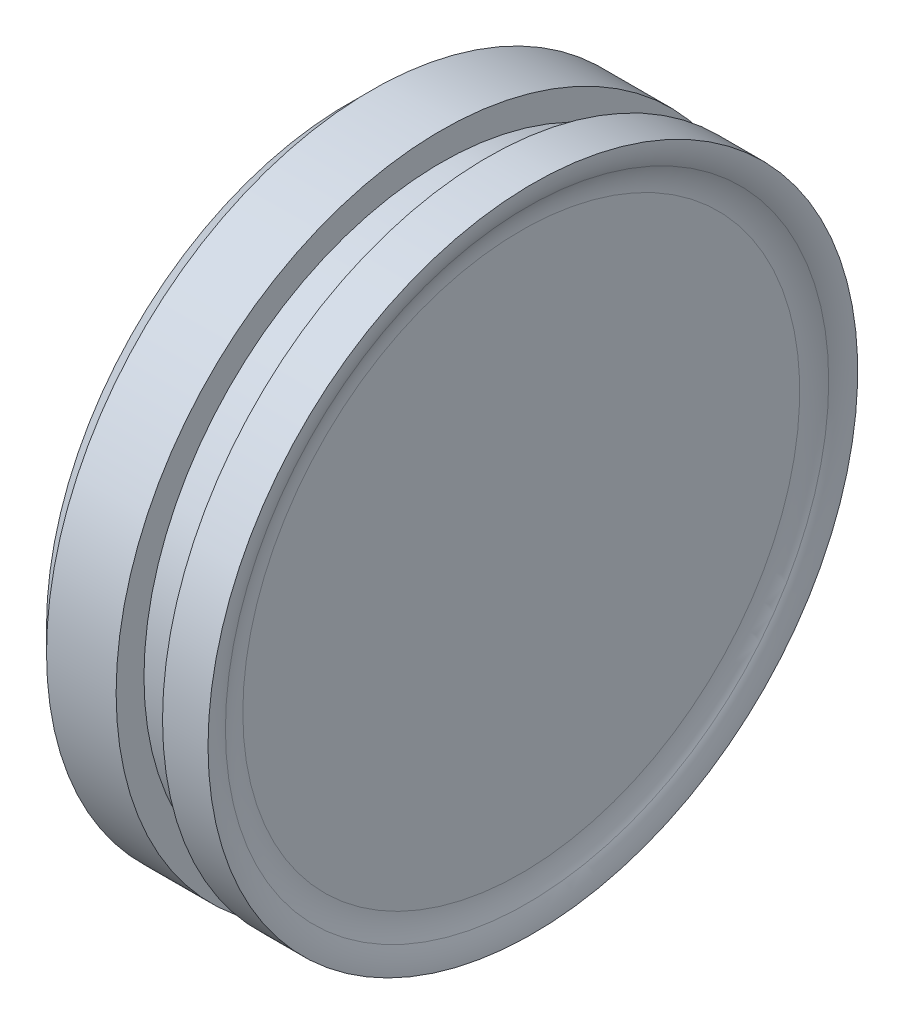
ISO-10303-21;
HEADER;
FILE_DESCRIPTION(('STEP AP214'),'2;1');
FILE_NAME('part.step','',(''),(''),'','','');
FILE_SCHEMA(('AUTOMOTIVE_DESIGN { 1 0 10303 214 1 1 1 1 }'));
ENDSEC;
DATA;
#1=APPLICATION_CONTEXT('core data for automotive mechanical design processes');
#2=APPLICATION_PROTOCOL_DEFINITION('international standard','automotive_design',2000,#1);
#3=PRODUCT_CONTEXT('',#1,'mechanical');
#4=PRODUCT('Part','Part','',(#3));
#5=PRODUCT_RELATED_PRODUCT_CATEGORY('part','',(#4));
#6=PRODUCT_DEFINITION_FORMATION('','',#4);
#7=PRODUCT_DEFINITION_CONTEXT('part definition',#1,'design');
#8=PRODUCT_DEFINITION('design','',#6,#7);
#9=PRODUCT_DEFINITION_SHAPE('','',#8);
#10=(LENGTH_UNIT() NAMED_UNIT(*) SI_UNIT(.MILLI.,.METRE.));
#11=(NAMED_UNIT(*) PLANE_ANGLE_UNIT() SI_UNIT($,.RADIAN.));
#12=(NAMED_UNIT(*) SI_UNIT($,.STERADIAN.) SOLID_ANGLE_UNIT());
#13=UNCERTAINTY_MEASURE_WITH_UNIT(LENGTH_MEASURE(1.E-05),#10,'distance_accuracy_value','');
#14=(GEOMETRIC_REPRESENTATION_CONTEXT(3) GLOBAL_UNCERTAINTY_ASSIGNED_CONTEXT((#13)) GLOBAL_UNIT_ASSIGNED_CONTEXT((#10,
#11,#12)) REPRESENTATION_CONTEXT('',''));
#15=CARTESIAN_POINT('',(0.,0.,0.));
#16=DIRECTION('',(0.,0.,1.));
#17=DIRECTION('',(1.,0.,0.));
#18=AXIS2_PLACEMENT_3D('',#15,#16,#17);
#19=CARTESIAN_POINT('',(0.,0.,0.));
#20=DIRECTION('',(1.,0.,0.));
#21=DIRECTION('',(0.,0.,-1.));
#22=AXIS2_PLACEMENT_3D('',#19,#20,#21);
#23=PLANE('',#22);
#24=CARTESIAN_POINT('',(0.,0.,0.));
#25=DIRECTION('',(1.,0.,0.));
#26=DIRECTION('',(0.,0.,-1.));
#27=AXIS2_PLACEMENT_3D('',#24,#25,#26);
#28=CIRCLE('',#27,6.5);
#29=CARTESIAN_POINT('',(0.,0.,-6.5));
#30=VERTEX_POINT('',#29);
#31=EDGE_CURVE('E47',#30,#30,#28,.F.);
#32=ORIENTED_EDGE('',*,*,#31,.T.);
#33=EDGE_LOOP('',(#32));
#34=FACE_BOUND('',#33,.T.);
#35=ADVANCED_FACE('F39',(#34),#23,.F.);
#36=CARTESIAN_POINT('',(0.,0.,0.));
#37=DIRECTION('',(-1.,0.,0.));
#38=DIRECTION('',(0.,0.,1.));
#39=AXIS2_PLACEMENT_3D('',#36,#37,#38);
#40=CYLINDRICAL_SURFACE('',#39,7.);
#41=CARTESIAN_POINT('',(0.500000000000005,0.,0.));
#42=DIRECTION('',(1.,0.,0.));
#43=DIRECTION('',(0.,0.,-1.));
#44=AXIS2_PLACEMENT_3D('',#41,#42,#43);
#45=CIRCLE('',#44,7.);
#46=CARTESIAN_POINT('',(0.500000000000005,0.,-7.));
#47=VERTEX_POINT('',#46);
#48=EDGE_CURVE('E10',#47,#47,#45,.T.);
#49=ORIENTED_EDGE('',*,*,#48,.T.);
#50=EDGE_LOOP('',(#49));
#51=FACE_BOUND('',#50,.T.);
#52=CARTESIAN_POINT('',(2.,0.,0.));
#53=DIRECTION('',(-1.,0.,0.));
#54=DIRECTION('',(0.,0.,1.));
#55=AXIS2_PLACEMENT_3D('',#52,#53,#54);
#56=CIRCLE('',#55,7.);
#57=CARTESIAN_POINT('',(2.,0.,7.));
#58=VERTEX_POINT('',#57);
#59=EDGE_CURVE('E51',#58,#58,#56,.T.);
#60=ORIENTED_EDGE('',*,*,#59,.T.);
#61=EDGE_LOOP('',(#60));
#62=FACE_BOUND('',#61,.T.);
#63=ADVANCED_FACE('F90',(#51,#62),#40,.T.);
#64=CARTESIAN_POINT('',(2.,7.,0.));
#65=DIRECTION('',(-1.,0.,0.));
#66=DIRECTION('',(0.,0.,1.));
#67=AXIS2_PLACEMENT_3D('',#64,#65,#66);
#68=PLANE('',#67);
#69=ORIENTED_EDGE('',*,*,#59,.F.);
#70=EDGE_LOOP('',(#69));
#71=FACE_BOUND('',#70,.T.);
#72=CARTESIAN_POINT('',(2.,0.,0.));
#73=DIRECTION('',(-1.,0.,0.));
#74=DIRECTION('',(0.,0.,1.));
#75=AXIS2_PLACEMENT_3D('',#72,#73,#74);
#76=CIRCLE('',#75,6.4);
#77=CARTESIAN_POINT('',(2.,0.,6.4));
#78=VERTEX_POINT('',#77);
#79=EDGE_CURVE('E55',#78,#78,#76,.T.);
#80=ORIENTED_EDGE('',*,*,#79,.T.);
#81=EDGE_LOOP('',(#80));
#82=FACE_BOUND('',#81,.T.);
#83=ADVANCED_FACE('F94',(#71,#82),#68,.F.);
#84=CARTESIAN_POINT('',(0.,0.,0.));
#85=DIRECTION('',(-1.,0.,0.));
#86=DIRECTION('',(0.,0.,1.));
#87=AXIS2_PLACEMENT_3D('',#84,#85,#86);
#88=CYLINDRICAL_SURFACE('',#87,6.4);
#89=ORIENTED_EDGE('',*,*,#79,.F.);
#90=EDGE_LOOP('',(#89));
#91=FACE_BOUND('',#90,.T.);
#92=CARTESIAN_POINT('',(3.,0.,0.));
#93=DIRECTION('',(-1.,0.,0.));
#94=DIRECTION('',(0.,0.,1.));
#95=AXIS2_PLACEMENT_3D('',#92,#93,#94);
#96=CIRCLE('',#95,6.4);
#97=CARTESIAN_POINT('',(3.,0.,6.4));
#98=VERTEX_POINT('',#97);
#99=EDGE_CURVE('E60',#98,#98,#96,.T.);
#100=ORIENTED_EDGE('',*,*,#99,.T.);
#101=EDGE_LOOP('',(#100));
#102=FACE_BOUND('',#101,.T.);
#103=ADVANCED_FACE('F99',(#91,#102),#88,.T.);
#104=CARTESIAN_POINT('',(3.,6.4,0.));
#105=DIRECTION('',(1.,0.,0.));
#106=DIRECTION('',(0.,0.,-1.));
#107=AXIS2_PLACEMENT_3D('',#104,#105,#106);
#108=PLANE('',#107);
#109=ORIENTED_EDGE('',*,*,#99,.F.);
#110=EDGE_LOOP('',(#109));
#111=FACE_BOUND('',#110,.T.);
#112=CARTESIAN_POINT('',(3.,0.,0.));
#113=DIRECTION('',(-1.,0.,0.));
#114=DIRECTION('',(0.,0.,1.));
#115=AXIS2_PLACEMENT_3D('',#112,#113,#114);
#116=CIRCLE('',#115,7.);
#117=CARTESIAN_POINT('',(3.,0.,7.));
#118=VERTEX_POINT('',#117);
#119=EDGE_CURVE('E63',#118,#118,#116,.T.);
#120=ORIENTED_EDGE('',*,*,#119,.T.);
#121=EDGE_LOOP('',(#120));
#122=FACE_BOUND('',#121,.T.);
#123=ADVANCED_FACE('F103',(#111,#122),#108,.F.);
#124=CARTESIAN_POINT('',(0.,0.,0.));
#125=DIRECTION('',(-1.,0.,0.));
#126=DIRECTION('',(0.,0.,1.));
#127=AXIS2_PLACEMENT_3D('',#124,#125,#126);
#128=CYLINDRICAL_SURFACE('',#127,7.);
#129=ORIENTED_EDGE('',*,*,#119,.F.);
#130=EDGE_LOOP('',(#129));
#131=FACE_BOUND('',#130,.T.);
#132=CARTESIAN_POINT('',(3.98,0.,0.));
#133=DIRECTION('',(-1.,0.,0.));
#134=DIRECTION('',(0.,0.,1.));
#135=AXIS2_PLACEMENT_3D('',#132,#133,#134);
#136=CIRCLE('',#135,7.);
#137=CARTESIAN_POINT('',(3.98,0.,7.));
#138=VERTEX_POINT('',#137);
#139=EDGE_CURVE('E66',#138,#138,#136,.T.);
#140=ORIENTED_EDGE('',*,*,#139,.T.);
#141=EDGE_LOOP('',(#140));
#142=FACE_BOUND('',#141,.T.);
#143=ADVANCED_FACE('F107',(#131,#142),#128,.T.);
#144=CARTESIAN_POINT('',(2.9175,0.,0.));
#145=DIRECTION('',(-1.,0.,0.));
#146=DIRECTION('',(0.,0.,1.));
#147=AXIS2_PLACEMENT_3D('',#144,#145,#146);
#148=TOROIDAL_SURFACE('',#147,7.,1.0625);
#149=ORIENTED_EDGE('',*,*,#139,.F.);
#150=EDGE_LOOP('',(#149));
#151=FACE_BOUND('',#150,.T.);
#152=CARTESIAN_POINT('',(3.855,0.,0.));
#153=DIRECTION('',(-1.,0.,0.));
#154=DIRECTION('',(0.,0.,1.));
#155=AXIS2_PLACEMENT_3D('',#152,#153,#154);
#156=CIRCLE('',#155,6.5);
#157=CARTESIAN_POINT('',(3.855,0.,6.5));
#158=VERTEX_POINT('',#157);
#159=EDGE_CURVE('E69',#158,#158,#156,.T.);
#160=ORIENTED_EDGE('',*,*,#159,.T.);
#161=EDGE_LOOP('',(#160));
#162=FACE_BOUND('',#161,.T.);
#163=ADVANCED_FACE('F87',(#151,#162),#148,.T.);
#164=CARTESIAN_POINT('',(4.7925,0.,0.));
#165=DIRECTION('',(-1.,0.,0.));
#166=DIRECTION('',(0.,0.,1.));
#167=AXIS2_PLACEMENT_3D('',#164,#165,#166);
#168=TOROIDAL_SURFACE('',#167,6.,1.0625);
#169=ORIENTED_EDGE('',*,*,#159,.F.);
#170=EDGE_LOOP('',(#169));
#171=FACE_BOUND('',#170,.T.);
#172=CARTESIAN_POINT('',(3.73,0.,0.));
#173=DIRECTION('',(-1.,0.,0.));
#174=DIRECTION('',(0.,0.,1.));
#175=AXIS2_PLACEMENT_3D('',#172,#173,#174);
#176=CIRCLE('',#175,6.);
#177=CARTESIAN_POINT('',(3.73,0.,6.));
#178=VERTEX_POINT('',#177);
#179=EDGE_CURVE('E72',#178,#178,#176,.T.);
#180=ORIENTED_EDGE('',*,*,#179,.T.);
#181=EDGE_LOOP('',(#180));
#182=FACE_BOUND('',#181,.T.);
#183=ADVANCED_FACE('F76',(#171,#182),#168,.F.);
#184=CARTESIAN_POINT('',(3.73,0.,0.));
#185=DIRECTION('',(-1.,0.,0.));
#186=DIRECTION('',(0.,0.,1.));
#187=AXIS2_PLACEMENT_3D('',#184,#185,#186);
#188=PLANE('',#187);
#189=ORIENTED_EDGE('',*,*,#179,.F.);
#190=EDGE_LOOP('',(#189));
#191=FACE_BOUND('',#190,.T.);
#192=ADVANCED_FACE('F78',(#191),#188,.F.);
#193=CARTESIAN_POINT('',(0.,0.,0.));
#194=DIRECTION('',(1.,0.,0.));
#195=DIRECTION('',(0.,0.,-1.));
#196=AXIS2_PLACEMENT_3D('',#193,#194,#195);
#197=CONICAL_SURFACE('',#196,6.5,0.785398163397447);
#198=ORIENTED_EDGE('',*,*,#48,.F.);
#199=EDGE_LOOP('',(#198));
#200=FACE_BOUND('',#199,.T.);
#201=ORIENTED_EDGE('',*,*,#31,.F.);
#202=EDGE_LOOP('',(#201));
#203=FACE_BOUND('',#202,.T.);
#204=ADVANCED_FACE('F42',(#200,#203),#197,.T.);
#205=CLOSED_SHELL('',(#35,#63,#83,#103,#123,#143,#163,#183,#192,#204));
#206=MANIFOLD_SOLID_BREP('B2',#205);
#207=ADVANCED_BREP_SHAPE_REPRESENTATION('',(#18,#206),#14);
#208=SHAPE_DEFINITION_REPRESENTATION(#9,#207);
ENDSEC;
END-ISO-10303-21;
